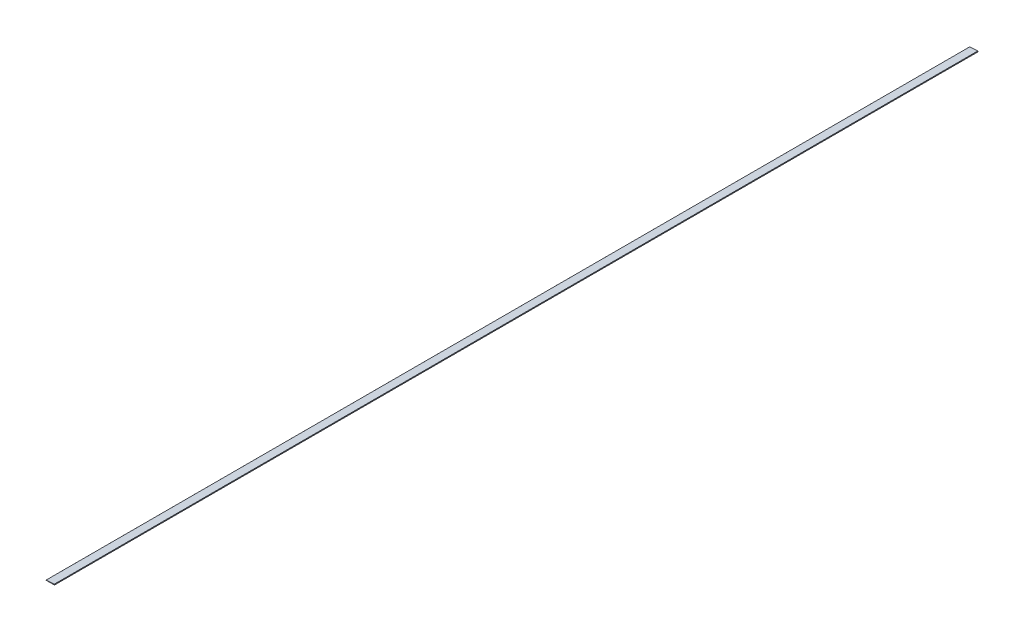
ISO-10303-21;
HEADER;
FILE_DESCRIPTION(('STEP AP214'),'2;1');
FILE_NAME('part.step','',(''),(''),'','','');
FILE_SCHEMA(('AUTOMOTIVE_DESIGN { 1 0 10303 214 1 1 1 1 }'));
ENDSEC;
DATA;
#1=APPLICATION_CONTEXT('core data for automotive mechanical design processes');
#2=APPLICATION_PROTOCOL_DEFINITION('international standard','automotive_design',2000,#1);
#3=PRODUCT_CONTEXT('',#1,'mechanical');
#4=PRODUCT('Part','Part','',(#3));
#5=PRODUCT_RELATED_PRODUCT_CATEGORY('part','',(#4));
#6=PRODUCT_DEFINITION_FORMATION('','',#4);
#7=PRODUCT_DEFINITION_CONTEXT('part definition',#1,'design');
#8=PRODUCT_DEFINITION('design','',#6,#7);
#9=PRODUCT_DEFINITION_SHAPE('','',#8);
#10=(LENGTH_UNIT() NAMED_UNIT(*) SI_UNIT(.MILLI.,.METRE.));
#11=(NAMED_UNIT(*) PLANE_ANGLE_UNIT() SI_UNIT($,.RADIAN.));
#12=(NAMED_UNIT(*) SI_UNIT($,.STERADIAN.) SOLID_ANGLE_UNIT());
#13=UNCERTAINTY_MEASURE_WITH_UNIT(LENGTH_MEASURE(1.E-05),#10,'distance_accuracy_value','');
#14=(GEOMETRIC_REPRESENTATION_CONTEXT(3) GLOBAL_UNCERTAINTY_ASSIGNED_CONTEXT((#13)) GLOBAL_UNIT_ASSIGNED_CONTEXT((#10,
#11,#12)) REPRESENTATION_CONTEXT('',''));
#15=CARTESIAN_POINT('',(0.,0.,0.));
#16=DIRECTION('',(0.,0.,1.));
#17=DIRECTION('',(1.,0.,0.));
#18=AXIS2_PLACEMENT_3D('',#15,#16,#17);
#19=CARTESIAN_POINT('',(50.8,0.,-5000.));
#20=DIRECTION('',(0.,-1.,0.));
#21=DIRECTION('',(1.,0.,0.));
#22=AXIS2_PLACEMENT_3D('',#19,#20,#21);
#23=PLANE('',#22);
#24=DIRECTION('',(1.,0.,0.));
#25=VECTOR('',#24,1.);
#26=CARTESIAN_POINT('',(50.8,0.,0.));
#27=LINE('',#26,#25);
#28=CARTESIAN_POINT('',(5.23580080437175,0.,0.));
#29=VERTEX_POINT('',#28);
#30=CARTESIAN_POINT('',(50.8,0.,0.));
#31=VERTEX_POINT('',#30);
#32=EDGE_CURVE('E94',#29,#31,#27,.T.);
#33=ORIENTED_EDGE('',*,*,#32,.F.);
#34=DIRECTION('',(0.,0.,1.));
#35=VECTOR('',#34,1.);
#36=CARTESIAN_POINT('',(5.23580080437175,0.,-5000.));
#37=LINE('',#36,#35);
#38=CARTESIAN_POINT('',(5.23580080437175,0.,-5000.));
#39=VERTEX_POINT('',#38);
#40=EDGE_CURVE('E41',#29,#39,#37,.F.);
#41=ORIENTED_EDGE('',*,*,#40,.T.);
#42=DIRECTION('',(1.,0.,0.));
#43=VECTOR('',#42,1.);
#44=CARTESIAN_POINT('',(50.8,0.,-5000.));
#45=LINE('',#44,#43);
#46=CARTESIAN_POINT('',(50.8,0.,-5000.));
#47=VERTEX_POINT('',#46);
#48=EDGE_CURVE('E70',#39,#47,#45,.T.);
#49=ORIENTED_EDGE('',*,*,#48,.T.);
#50=DIRECTION('',(0.,0.,1.));
#51=VECTOR('',#50,1.);
#52=CARTESIAN_POINT('',(50.8,0.,-5000.));
#53=LINE('',#52,#51);
#54=EDGE_CURVE('E72',#47,#31,#53,.T.);
#55=ORIENTED_EDGE('',*,*,#54,.T.);
#56=EDGE_LOOP('',(#33,#41,#49,#55));
#57=FACE_BOUND('',#56,.T.);
#58=ADVANCED_FACE('F33',(#57),#23,.T.);
#59=CARTESIAN_POINT('',(0.,0.,-5000.));
#60=DIRECTION('',(-0.0871557427476517,0.996194698091746,0.));
#61=DIRECTION('',(-0.996194698091746,-0.0871557427476517,0.));
#62=AXIS2_PLACEMENT_3D('',#59,#60,#61);
#63=PLANE('',#62);
#64=DIRECTION('',(-0.996194698091746,-0.0871557427476517,0.));
#65=VECTOR('',#64,1.);
#66=CARTESIAN_POINT('',(0.,0.,-5000.));
#67=LINE('',#66,#65);
#68=CARTESIAN_POINT('',(50.4141169265101,4.4106637127397,-5000.));
#69=VERTEX_POINT('',#68);
#70=CARTESIAN_POINT('',(5.21587700157964,0.456330107983772,-5000.));
#71=VERTEX_POINT('',#70);
#72=EDGE_CURVE('E87',#69,#71,#67,.T.);
#73=ORIENTED_EDGE('',*,*,#72,.T.);
#74=DIRECTION('',(0.,0.,1.));
#75=VECTOR('',#74,1.);
#76=CARTESIAN_POINT('',(5.21587700157964,0.456330107983772,-5000.));
#77=LINE('',#76,#75);
#78=CARTESIAN_POINT('',(5.21587700157964,0.456330107983772,0.));
#79=VERTEX_POINT('',#78);
#80=EDGE_CURVE('E98',#71,#79,#77,.T.);
#81=ORIENTED_EDGE('',*,*,#80,.T.);
#82=DIRECTION('',(-0.996194698091746,-0.0871557427476517,0.));
#83=VECTOR('',#82,1.);
#84=CARTESIAN_POINT('',(0.,0.,0.));
#85=LINE('',#84,#83);
#86=CARTESIAN_POINT('',(50.4141169265101,4.4106637127397,0.));
#87=VERTEX_POINT('',#86);
#88=EDGE_CURVE('E78',#87,#79,#85,.T.);
#89=ORIENTED_EDGE('',*,*,#88,.F.);
#90=DIRECTION('',(0.,0.,1.));
#91=VECTOR('',#90,1.);
#92=CARTESIAN_POINT('',(50.4141169265101,4.4106637127397,-5000.));
#93=LINE('',#92,#91);
#94=EDGE_CURVE('E86',#69,#87,#93,.T.);
#95=ORIENTED_EDGE('',*,*,#94,.F.);
#96=EDGE_LOOP('',(#73,#81,#89,#95));
#97=FACE_BOUND('',#96,.T.);
#98=ADVANCED_FACE('F105',(#97),#63,.T.);
#99=CARTESIAN_POINT('',(50.4141169265101,4.4106637127397,-5000.));
#100=DIRECTION('',(0.996194698091745,0.0871557427476606,0.));
#101=DIRECTION('',(-0.0871557427476606,0.996194698091745,0.));
#102=AXIS2_PLACEMENT_3D('',#99,#100,#101);
#103=PLANE('',#102);
#104=DIRECTION('',(-0.0871557427476606,0.996194698091745,0.));
#105=VECTOR('',#104,1.);
#106=CARTESIAN_POINT('',(50.4141169265101,4.4106637127397,0.));
#107=LINE('',#106,#105);
#108=EDGE_CURVE('E85',#31,#87,#107,.T.);
#109=ORIENTED_EDGE('',*,*,#108,.F.);
#110=ORIENTED_EDGE('',*,*,#54,.F.);
#111=DIRECTION('',(-0.0871557427476606,0.996194698091745,0.));
#112=VECTOR('',#111,1.);
#113=CARTESIAN_POINT('',(50.4141169265101,4.4106637127397,-5000.));
#114=LINE('',#113,#112);
#115=EDGE_CURVE('E77',#47,#69,#114,.T.);
#116=ORIENTED_EDGE('',*,*,#115,.T.);
#117=ORIENTED_EDGE('',*,*,#94,.T.);
#118=EDGE_LOOP('',(#109,#110,#116,#117));
#119=FACE_BOUND('',#118,.T.);
#120=ADVANCED_FACE('F82',(#119),#103,.T.);
#121=CARTESIAN_POINT('',(0.,0.,-5000.));
#122=DIRECTION('',(0.,0.,1.));
#123=DIRECTION('',(1.,0.,0.));
#124=AXIS2_PLACEMENT_3D('',#121,#122,#123);
#125=PLANE('',#124);
#126=ORIENTED_EDGE('',*,*,#48,.F.);
#127=CARTESIAN_POINT('',(5.23580080437175,0.228599999999999,-5000.));
#128=DIRECTION('',(0.,0.,1.));
#129=DIRECTION('',(1.,0.,0.));
#130=AXIS2_PLACEMENT_3D('',#127,#128,#129);
#131=CIRCLE('',#130,0.2286);
#132=EDGE_CURVE('E11',#39,#71,#131,.F.);
#133=ORIENTED_EDGE('',*,*,#132,.T.);
#134=ORIENTED_EDGE('',*,*,#72,.F.);
#135=ORIENTED_EDGE('',*,*,#115,.F.);
#136=EDGE_LOOP('',(#126,#133,#134,#135));
#137=FACE_BOUND('',#136,.T.);
#138=ADVANCED_FACE('F89',(#137),#125,.F.);
#139=CARTESIAN_POINT('',(0.,0.,0.));
#140=DIRECTION('',(0.,0.,1.));
#141=DIRECTION('',(1.,0.,0.));
#142=AXIS2_PLACEMENT_3D('',#139,#140,#141);
#143=PLANE('',#142);
#144=ORIENTED_EDGE('',*,*,#88,.T.);
#145=CARTESIAN_POINT('',(5.23580080437175,0.228599999999999,0.));
#146=DIRECTION('',(0.,0.,1.));
#147=DIRECTION('',(1.,0.,0.));
#148=AXIS2_PLACEMENT_3D('',#145,#146,#147);
#149=CIRCLE('',#148,0.2286);
#150=EDGE_CURVE('E55',#79,#29,#149,.T.);
#151=ORIENTED_EDGE('',*,*,#150,.T.);
#152=ORIENTED_EDGE('',*,*,#32,.T.);
#153=ORIENTED_EDGE('',*,*,#108,.T.);
#154=EDGE_LOOP('',(#144,#151,#152,#153));
#155=FACE_BOUND('',#154,.T.);
#156=ADVANCED_FACE('F107',(#155),#143,.T.);
#157=CARTESIAN_POINT('',(5.23580080437175,0.228599999999999,-5000.));
#158=DIRECTION('',(0.,0.,1.));
#159=DIRECTION('',(1.,0.,0.));
#160=AXIS2_PLACEMENT_3D('',#157,#158,#159);
#161=CYLINDRICAL_SURFACE('',#160,0.2286);
#162=ORIENTED_EDGE('',*,*,#132,.F.);
#163=ORIENTED_EDGE('',*,*,#40,.F.);
#164=ORIENTED_EDGE('',*,*,#150,.F.);
#165=ORIENTED_EDGE('',*,*,#80,.F.);
#166=EDGE_LOOP('',(#162,#163,#164,#165));
#167=FACE_BOUND('',#166,.T.);
#168=ADVANCED_FACE('F35',(#167),#161,.T.);
#169=CLOSED_SHELL('',(#58,#98,#120,#138,#156,#168));
#170=MANIFOLD_SOLID_BREP('B2',#169);
#171=ADVANCED_BREP_SHAPE_REPRESENTATION('',(#18,#170),#14);
#172=SHAPE_DEFINITION_REPRESENTATION(#9,#171);
ENDSEC;
END-ISO-10303-21;
